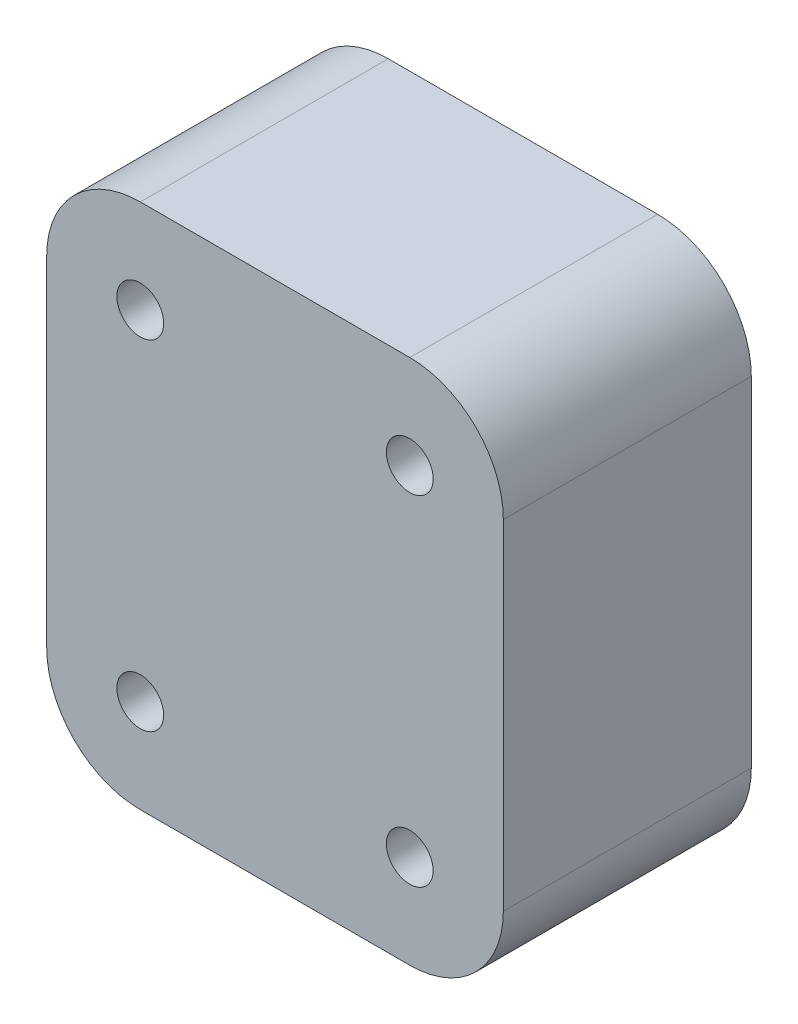
ISO-10303-21;
HEADER;
FILE_DESCRIPTION(('STEP AP214'),'2;1');
FILE_NAME('part.step','',(''),(''),'','','');
FILE_SCHEMA(('AUTOMOTIVE_DESIGN { 1 0 10303 214 1 1 1 1 }'));
ENDSEC;
DATA;
#1=APPLICATION_CONTEXT('core data for automotive mechanical design processes');
#2=APPLICATION_PROTOCOL_DEFINITION('international standard','automotive_design',2000,#1);
#3=PRODUCT_CONTEXT('',#1,'mechanical');
#4=PRODUCT('Part','Part','',(#3));
#5=PRODUCT_RELATED_PRODUCT_CATEGORY('part','',(#4));
#6=PRODUCT_DEFINITION_FORMATION('','',#4);
#7=PRODUCT_DEFINITION_CONTEXT('part definition',#1,'design');
#8=PRODUCT_DEFINITION('design','',#6,#7);
#9=PRODUCT_DEFINITION_SHAPE('','',#8);
#10=(LENGTH_UNIT() NAMED_UNIT(*) SI_UNIT(.MILLI.,.METRE.));
#11=(NAMED_UNIT(*) PLANE_ANGLE_UNIT() SI_UNIT($,.RADIAN.));
#12=(NAMED_UNIT(*) SI_UNIT($,.STERADIAN.) SOLID_ANGLE_UNIT());
#13=UNCERTAINTY_MEASURE_WITH_UNIT(LENGTH_MEASURE(1.E-05),#10,'distance_accuracy_value','');
#14=(GEOMETRIC_REPRESENTATION_CONTEXT(3) GLOBAL_UNCERTAINTY_ASSIGNED_CONTEXT((#13)) GLOBAL_UNIT_ASSIGNED_CONTEXT((#10,
#11,#12)) REPRESENTATION_CONTEXT('',''));
#15=CARTESIAN_POINT('',(0.,0.,0.));
#16=DIRECTION('',(0.,0.,1.));
#17=DIRECTION('',(1.,0.,0.));
#18=AXIS2_PLACEMENT_3D('',#15,#16,#17);
#19=CARTESIAN_POINT('',(0.,0.,26.5));
#20=DIRECTION('',(0.,0.,-1.));
#21=DIRECTION('',(-1.,0.,0.));
#22=AXIS2_PLACEMENT_3D('',#19,#20,#21);
#23=PLANE('',#22);
#24=DIRECTION('',(0.,-1.,0.));
#25=VECTOR('',#24,1.);
#26=CARTESIAN_POINT('',(-40.1937500000003,28.125,26.5));
#27=LINE('',#26,#25);
#28=CARTESIAN_POINT('',(-40.1937500000003,18.125,26.5));
#29=VERTEX_POINT('',#28);
#30=CARTESIAN_POINT('',(-40.1937500000003,-18.125,26.5));
#31=VERTEX_POINT('',#30);
#32=EDGE_CURVE('E168',#29,#31,#27,.T.);
#33=ORIENTED_EDGE('',*,*,#32,.T.);
#34=CARTESIAN_POINT('',(-30.1937500000003,-18.125,26.5));
#35=DIRECTION('',(0.,0.,-1.));
#36=DIRECTION('',(-1.,0.,0.));
#37=AXIS2_PLACEMENT_3D('',#34,#35,#36);
#38=CIRCLE('',#37,10.);
#39=CARTESIAN_POINT('',(-30.1937500000003,-28.125,26.5));
#40=VERTEX_POINT('',#39);
#41=EDGE_CURVE('E148',#31,#40,#38,.F.);
#42=ORIENTED_EDGE('',*,*,#41,.T.);
#43=DIRECTION('',(1.,0.,0.));
#44=VECTOR('',#43,1.);
#45=CARTESIAN_POINT('',(-40.1937500000003,-28.125,26.5));
#46=LINE('',#45,#44);
#47=CARTESIAN_POINT('',(-1.39375000000027,-28.125,26.5));
#48=VERTEX_POINT('',#47);
#49=EDGE_CURVE('E118',#40,#48,#46,.T.);
#50=ORIENTED_EDGE('',*,*,#49,.T.);
#51=CARTESIAN_POINT('',(-1.39375000000027,-18.125,26.5));
#52=DIRECTION('',(0.,0.,-1.));
#53=DIRECTION('',(-1.,0.,0.));
#54=AXIS2_PLACEMENT_3D('',#51,#52,#53);
#55=CIRCLE('',#54,10.);
#56=CARTESIAN_POINT('',(8.60624999999973,-18.125,26.5));
#57=VERTEX_POINT('',#56);
#58=EDGE_CURVE('E54',#48,#57,#55,.F.);
#59=ORIENTED_EDGE('',*,*,#58,.T.);
#60=DIRECTION('',(0.,1.,0.));
#61=VECTOR('',#60,1.);
#62=CARTESIAN_POINT('',(8.60624999999974,28.125,26.5));
#63=LINE('',#62,#61);
#64=CARTESIAN_POINT('',(8.60624999999974,18.125,26.5));
#65=VERTEX_POINT('',#64);
#66=EDGE_CURVE('E135',#57,#65,#63,.T.);
#67=ORIENTED_EDGE('',*,*,#66,.T.);
#68=CARTESIAN_POINT('',(-1.39375000000026,18.125,26.5));
#69=DIRECTION('',(0.,0.,-1.));
#70=DIRECTION('',(-1.,0.,0.));
#71=AXIS2_PLACEMENT_3D('',#68,#69,#70);
#72=CIRCLE('',#71,10.);
#73=CARTESIAN_POINT('',(-1.39375000000026,28.125,26.5));
#74=VERTEX_POINT('',#73);
#75=EDGE_CURVE('E143',#65,#74,#72,.F.);
#76=ORIENTED_EDGE('',*,*,#75,.T.);
#77=DIRECTION('',(-1.,0.,0.));
#78=VECTOR('',#77,1.);
#79=CARTESIAN_POINT('',(-40.1937500000003,28.125,26.5));
#80=LINE('',#79,#78);
#81=CARTESIAN_POINT('',(-30.1937500000003,28.125,26.5));
#82=VERTEX_POINT('',#81);
#83=EDGE_CURVE('E129',#74,#82,#80,.T.);
#84=ORIENTED_EDGE('',*,*,#83,.T.);
#85=CARTESIAN_POINT('',(-30.1937500000003,18.125,26.5));
#86=DIRECTION('',(0.,0.,-1.));
#87=DIRECTION('',(-1.,0.,0.));
#88=AXIS2_PLACEMENT_3D('',#85,#86,#87);
#89=CIRCLE('',#88,10.);
#90=EDGE_CURVE('E146',#82,#29,#89,.F.);
#91=ORIENTED_EDGE('',*,*,#90,.T.);
#92=EDGE_LOOP('',(#33,#42,#50,#59,#67,#76,#84,#91));
#93=FACE_BOUND('',#92,.T.);
#94=CARTESIAN_POINT('',(-1.39375000000027,-18.125,26.5));
#95=DIRECTION('',(0.,0.,1.));
#96=DIRECTION('',(1.,0.,0.));
#97=AXIS2_PLACEMENT_3D('',#94,#95,#96);
#98=CIRCLE('',#97,2.5);
#99=CARTESIAN_POINT('',(1.10624999999973,-18.125,26.5));
#100=VERTEX_POINT('',#99);
#101=EDGE_CURVE('E174',#100,#100,#98,.T.);
#102=ORIENTED_EDGE('',*,*,#101,.F.);
#103=EDGE_LOOP('',(#102));
#104=FACE_BOUND('',#103,.T.);
#105=CARTESIAN_POINT('',(-30.1937500000003,-18.125,26.5));
#106=DIRECTION('',(0.,0.,1.));
#107=DIRECTION('',(1.,0.,0.));
#108=AXIS2_PLACEMENT_3D('',#105,#106,#107);
#109=CIRCLE('',#108,2.5);
#110=CARTESIAN_POINT('',(-27.6937500000003,-18.125,26.5));
#111=VERTEX_POINT('',#110);
#112=EDGE_CURVE('E183',#111,#111,#109,.T.);
#113=ORIENTED_EDGE('',*,*,#112,.F.);
#114=EDGE_LOOP('',(#113));
#115=FACE_BOUND('',#114,.T.);
#116=CARTESIAN_POINT('',(-1.39375000000027,18.125,26.5));
#117=DIRECTION('',(0.,0.,1.));
#118=DIRECTION('',(1.,0.,0.));
#119=AXIS2_PLACEMENT_3D('',#116,#117,#118);
#120=CIRCLE('',#119,2.5);
#121=CARTESIAN_POINT('',(1.10624999999973,18.125,26.5));
#122=VERTEX_POINT('',#121);
#123=EDGE_CURVE('E188',#122,#122,#120,.T.);
#124=ORIENTED_EDGE('',*,*,#123,.F.);
#125=EDGE_LOOP('',(#124));
#126=FACE_BOUND('',#125,.T.);
#127=CARTESIAN_POINT('',(-30.1937500000003,18.125,26.5));
#128=DIRECTION('',(0.,0.,1.));
#129=DIRECTION('',(1.,0.,0.));
#130=AXIS2_PLACEMENT_3D('',#127,#128,#129);
#131=CIRCLE('',#130,2.5);
#132=CARTESIAN_POINT('',(-27.6937500000003,18.125,26.5));
#133=VERTEX_POINT('',#132);
#134=EDGE_CURVE('E194',#133,#133,#131,.T.);
#135=ORIENTED_EDGE('',*,*,#134,.F.);
#136=EDGE_LOOP('',(#135));
#137=FACE_BOUND('',#136,.T.);
#138=ADVANCED_FACE('F33',(#93,#104,#115,#126,#137),#23,.F.);
#139=CARTESIAN_POINT('',(0.,0.,0.));
#140=DIRECTION('',(0.,0.,-1.));
#141=DIRECTION('',(-1.,0.,0.));
#142=AXIS2_PLACEMENT_3D('',#139,#140,#141);
#143=PLANE('',#142);
#144=CARTESIAN_POINT('',(-1.39375000000027,18.125,0.));
#145=DIRECTION('',(0.,0.,1.));
#146=DIRECTION('',(1.,0.,0.));
#147=AXIS2_PLACEMENT_3D('',#144,#145,#146);
#148=CIRCLE('',#147,2.5);
#149=CARTESIAN_POINT('',(1.10624999999973,18.125,0.));
#150=VERTEX_POINT('',#149);
#151=EDGE_CURVE('E191',#150,#150,#148,.T.);
#152=ORIENTED_EDGE('',*,*,#151,.T.);
#153=EDGE_LOOP('',(#152));
#154=FACE_BOUND('',#153,.T.);
#155=CARTESIAN_POINT('',(-1.39375000000027,-18.125,0.));
#156=DIRECTION('',(0.,0.,1.));
#157=DIRECTION('',(1.,0.,0.));
#158=AXIS2_PLACEMENT_3D('',#155,#156,#157);
#159=CIRCLE('',#158,2.5);
#160=CARTESIAN_POINT('',(1.10624999999973,-18.125,0.));
#161=VERTEX_POINT('',#160);
#162=EDGE_CURVE('E176',#161,#161,#159,.T.);
#163=ORIENTED_EDGE('',*,*,#162,.T.);
#164=EDGE_LOOP('',(#163));
#165=FACE_BOUND('',#164,.T.);
#166=DIRECTION('',(1.,0.,0.));
#167=VECTOR('',#166,1.);
#168=CARTESIAN_POINT('',(-40.1937500000003,-28.125,0.));
#169=LINE('',#168,#167);
#170=CARTESIAN_POINT('',(-30.1937500000003,-28.125,0.));
#171=VERTEX_POINT('',#170);
#172=CARTESIAN_POINT('',(-1.39375000000027,-28.125,0.));
#173=VERTEX_POINT('',#172);
#174=EDGE_CURVE('E116',#171,#173,#169,.T.);
#175=ORIENTED_EDGE('',*,*,#174,.F.);
#176=CARTESIAN_POINT('',(-30.1937500000003,-18.125,0.));
#177=DIRECTION('',(0.,0.,-1.));
#178=DIRECTION('',(-1.,0.,0.));
#179=AXIS2_PLACEMENT_3D('',#176,#177,#178);
#180=CIRCLE('',#179,10.);
#181=CARTESIAN_POINT('',(-40.1937500000003,-18.125,0.));
#182=VERTEX_POINT('',#181);
#183=EDGE_CURVE('E99',#171,#182,#180,.T.);
#184=ORIENTED_EDGE('',*,*,#183,.T.);
#185=DIRECTION('',(0.,-1.,0.));
#186=VECTOR('',#185,1.);
#187=CARTESIAN_POINT('',(-40.1937500000003,28.125,0.));
#188=LINE('',#187,#186);
#189=CARTESIAN_POINT('',(-40.1937500000003,18.125,0.));
#190=VERTEX_POINT('',#189);
#191=EDGE_CURVE('E127',#190,#182,#188,.T.);
#192=ORIENTED_EDGE('',*,*,#191,.F.);
#193=CARTESIAN_POINT('',(-30.1937500000003,18.125,0.));
#194=DIRECTION('',(0.,0.,-1.));
#195=DIRECTION('',(-1.,0.,0.));
#196=AXIS2_PLACEMENT_3D('',#193,#194,#195);
#197=CIRCLE('',#196,10.);
#198=CARTESIAN_POINT('',(-30.1937500000003,28.125,0.));
#199=VERTEX_POINT('',#198);
#200=EDGE_CURVE('E110',#190,#199,#197,.T.);
#201=ORIENTED_EDGE('',*,*,#200,.T.);
#202=DIRECTION('',(-1.,0.,0.));
#203=VECTOR('',#202,1.);
#204=CARTESIAN_POINT('',(-40.1937500000003,28.125,0.));
#205=LINE('',#204,#203);
#206=CARTESIAN_POINT('',(-1.39375000000026,28.125,0.));
#207=VERTEX_POINT('',#206);
#208=EDGE_CURVE('E131',#207,#199,#205,.T.);
#209=ORIENTED_EDGE('',*,*,#208,.F.);
#210=CARTESIAN_POINT('',(-1.39375000000026,18.125,0.));
#211=DIRECTION('',(0.,0.,-1.));
#212=DIRECTION('',(-1.,0.,0.));
#213=AXIS2_PLACEMENT_3D('',#210,#211,#212);
#214=CIRCLE('',#213,10.);
#215=CARTESIAN_POINT('',(8.60624999999974,18.125,0.));
#216=VERTEX_POINT('',#215);
#217=EDGE_CURVE('E119',#207,#216,#214,.T.);
#218=ORIENTED_EDGE('',*,*,#217,.T.);
#219=DIRECTION('',(0.,1.,0.));
#220=VECTOR('',#219,1.);
#221=CARTESIAN_POINT('',(8.60624999999974,28.125,0.));
#222=LINE('',#221,#220);
#223=CARTESIAN_POINT('',(8.60624999999973,-18.125,0.));
#224=VERTEX_POINT('',#223);
#225=EDGE_CURVE('E126',#224,#216,#222,.T.);
#226=ORIENTED_EDGE('',*,*,#225,.F.);
#227=CARTESIAN_POINT('',(-1.39375000000027,-18.125,0.));
#228=DIRECTION('',(0.,0.,-1.));
#229=DIRECTION('',(-1.,0.,0.));
#230=AXIS2_PLACEMENT_3D('',#227,#228,#229);
#231=CIRCLE('',#230,10.);
#232=EDGE_CURVE('E125',#224,#173,#231,.T.);
#233=ORIENTED_EDGE('',*,*,#232,.T.);
#234=EDGE_LOOP('',(#175,#184,#192,#201,#209,#218,#226,#233));
#235=FACE_BOUND('',#234,.T.);
#236=CARTESIAN_POINT('',(-30.1937500000003,-18.125,0.));
#237=DIRECTION('',(0.,0.,1.));
#238=DIRECTION('',(1.,0.,0.));
#239=AXIS2_PLACEMENT_3D('',#236,#237,#238);
#240=CIRCLE('',#239,2.5);
#241=CARTESIAN_POINT('',(-27.6937500000003,-18.125,0.));
#242=VERTEX_POINT('',#241);
#243=EDGE_CURVE('E185',#242,#242,#240,.T.);
#244=ORIENTED_EDGE('',*,*,#243,.T.);
#245=EDGE_LOOP('',(#244));
#246=FACE_BOUND('',#245,.T.);
#247=CARTESIAN_POINT('',(-30.1937500000003,18.125,0.));
#248=DIRECTION('',(0.,0.,1.));
#249=DIRECTION('',(1.,0.,0.));
#250=AXIS2_PLACEMENT_3D('',#247,#248,#249);
#251=CIRCLE('',#250,2.5);
#252=CARTESIAN_POINT('',(-27.6937500000003,18.125,0.));
#253=VERTEX_POINT('',#252);
#254=EDGE_CURVE('E197',#253,#253,#251,.T.);
#255=ORIENTED_EDGE('',*,*,#254,.T.);
#256=EDGE_LOOP('',(#255));
#257=FACE_BOUND('',#256,.T.);
#258=ADVANCED_FACE('F122',(#154,#165,#235,#246,#257),#143,.T.);
#259=CARTESIAN_POINT('',(-40.1937500000003,28.125,26.5));
#260=DIRECTION('',(0.,-1.,0.));
#261=DIRECTION('',(0.,0.,-1.));
#262=AXIS2_PLACEMENT_3D('',#259,#260,#261);
#263=PLANE('',#262);
#264=ORIENTED_EDGE('',*,*,#208,.T.);
#265=DIRECTION('',(0.,0.,-1.));
#266=VECTOR('',#265,1.);
#267=CARTESIAN_POINT('',(-30.1937500000003,28.125,26.5));
#268=LINE('',#267,#266);
#269=EDGE_CURVE('E153',#199,#82,#268,.F.);
#270=ORIENTED_EDGE('',*,*,#269,.T.);
#271=ORIENTED_EDGE('',*,*,#83,.F.);
#272=DIRECTION('',(0.,0.,-1.));
#273=VECTOR('',#272,1.);
#274=CARTESIAN_POINT('',(-1.39375000000026,28.125,26.5));
#275=LINE('',#274,#273);
#276=EDGE_CURVE('E150',#74,#207,#275,.T.);
#277=ORIENTED_EDGE('',*,*,#276,.T.);
#278=EDGE_LOOP('',(#264,#270,#271,#277));
#279=FACE_BOUND('',#278,.T.);
#280=ADVANCED_FACE('F159',(#279),#263,.F.);
#281=CARTESIAN_POINT('',(-40.1937500000003,28.125,26.5));
#282=DIRECTION('',(1.,0.,0.));
#283=DIRECTION('',(0.,0.,-1.));
#284=AXIS2_PLACEMENT_3D('',#281,#282,#283);
#285=PLANE('',#284);
#286=ORIENTED_EDGE('',*,*,#191,.T.);
#287=DIRECTION('',(0.,0.,-1.));
#288=VECTOR('',#287,1.);
#289=CARTESIAN_POINT('',(-40.1937500000003,-18.125,26.5));
#290=LINE('',#289,#288);
#291=EDGE_CURVE('E104',#182,#31,#290,.F.);
#292=ORIENTED_EDGE('',*,*,#291,.T.);
#293=ORIENTED_EDGE('',*,*,#32,.F.);
#294=DIRECTION('',(0.,0.,-1.));
#295=VECTOR('',#294,1.);
#296=CARTESIAN_POINT('',(-40.1937500000003,18.125,26.5));
#297=LINE('',#296,#295);
#298=EDGE_CURVE('E109',#29,#190,#297,.T.);
#299=ORIENTED_EDGE('',*,*,#298,.T.);
#300=EDGE_LOOP('',(#286,#292,#293,#299));
#301=FACE_BOUND('',#300,.T.);
#302=ADVANCED_FACE('F173',(#301),#285,.F.);
#303=CARTESIAN_POINT('',(-40.1937500000003,-28.125,26.5));
#304=DIRECTION('',(0.,1.,0.));
#305=DIRECTION('',(0.,0.,1.));
#306=AXIS2_PLACEMENT_3D('',#303,#304,#305);
#307=PLANE('',#306);
#308=ORIENTED_EDGE('',*,*,#49,.F.);
#309=DIRECTION('',(0.,0.,-1.));
#310=VECTOR('',#309,1.);
#311=CARTESIAN_POINT('',(-30.1937500000003,-28.125,26.5));
#312=LINE('',#311,#310);
#313=EDGE_CURVE('E103',#40,#171,#312,.T.);
#314=ORIENTED_EDGE('',*,*,#313,.T.);
#315=ORIENTED_EDGE('',*,*,#174,.T.);
#316=DIRECTION('',(0.,0.,-1.));
#317=VECTOR('',#316,1.);
#318=CARTESIAN_POINT('',(-1.39375000000027,-28.125,26.5));
#319=LINE('',#318,#317);
#320=EDGE_CURVE('E120',#173,#48,#319,.F.);
#321=ORIENTED_EDGE('',*,*,#320,.T.);
#322=EDGE_LOOP('',(#308,#314,#315,#321));
#323=FACE_BOUND('',#322,.T.);
#324=ADVANCED_FACE('F115',(#323),#307,.F.);
#325=CARTESIAN_POINT('',(8.60624999999974,28.125,26.5));
#326=DIRECTION('',(-1.,0.,0.));
#327=DIRECTION('',(0.,-1.,0.));
#328=AXIS2_PLACEMENT_3D('',#325,#326,#327);
#329=PLANE('',#328);
#330=ORIENTED_EDGE('',*,*,#66,.F.);
#331=DIRECTION('',(0.,0.,-1.));
#332=VECTOR('',#331,1.);
#333=CARTESIAN_POINT('',(8.60624999999973,-18.125,26.5));
#334=LINE('',#333,#332);
#335=EDGE_CURVE('E11',#57,#224,#334,.T.);
#336=ORIENTED_EDGE('',*,*,#335,.T.);
#337=ORIENTED_EDGE('',*,*,#225,.T.);
#338=DIRECTION('',(0.,0.,-1.));
#339=VECTOR('',#338,1.);
#340=CARTESIAN_POINT('',(8.60624999999974,18.125,26.5));
#341=LINE('',#340,#339);
#342=EDGE_CURVE('E41',#216,#65,#341,.F.);
#343=ORIENTED_EDGE('',*,*,#342,.T.);
#344=EDGE_LOOP('',(#330,#336,#337,#343));
#345=FACE_BOUND('',#344,.T.);
#346=ADVANCED_FACE('F217',(#345),#329,.F.);
#347=CARTESIAN_POINT('',(-1.39375000000027,-18.125,26.5));
#348=DIRECTION('',(0.,0.,-1.));
#349=DIRECTION('',(-1.,0.,0.));
#350=AXIS2_PLACEMENT_3D('',#347,#348,#349);
#351=CYLINDRICAL_SURFACE('',#350,2.5);
#352=ORIENTED_EDGE('',*,*,#101,.T.);
#353=EDGE_LOOP('',(#352));
#354=FACE_BOUND('',#353,.T.);
#355=ORIENTED_EDGE('',*,*,#162,.F.);
#356=EDGE_LOOP('',(#355));
#357=FACE_BOUND('',#356,.T.);
#358=ADVANCED_FACE('F214',(#354,#357),#351,.F.);
#359=CARTESIAN_POINT('',(-30.1937500000003,-18.125,26.5));
#360=DIRECTION('',(0.,0.,-1.));
#361=DIRECTION('',(-1.,0.,0.));
#362=AXIS2_PLACEMENT_3D('',#359,#360,#361);
#363=CYLINDRICAL_SURFACE('',#362,2.5);
#364=ORIENTED_EDGE('',*,*,#112,.T.);
#365=EDGE_LOOP('',(#364));
#366=FACE_BOUND('',#365,.T.);
#367=ORIENTED_EDGE('',*,*,#243,.F.);
#368=EDGE_LOOP('',(#367));
#369=FACE_BOUND('',#368,.T.);
#370=ADVANCED_FACE('F309',(#366,#369),#363,.F.);
#371=CARTESIAN_POINT('',(-1.39375000000027,18.125,26.5));
#372=DIRECTION('',(0.,0.,-1.));
#373=DIRECTION('',(-1.,0.,0.));
#374=AXIS2_PLACEMENT_3D('',#371,#372,#373);
#375=CYLINDRICAL_SURFACE('',#374,2.5);
#376=ORIENTED_EDGE('',*,*,#123,.T.);
#377=EDGE_LOOP('',(#376));
#378=FACE_BOUND('',#377,.T.);
#379=ORIENTED_EDGE('',*,*,#151,.F.);
#380=EDGE_LOOP('',(#379));
#381=FACE_BOUND('',#380,.T.);
#382=ADVANCED_FACE('F300',(#378,#381),#375,.F.);
#383=CARTESIAN_POINT('',(-30.1937500000003,18.125,26.5));
#384=DIRECTION('',(0.,0.,-1.));
#385=DIRECTION('',(-1.,0.,0.));
#386=AXIS2_PLACEMENT_3D('',#383,#384,#385);
#387=CYLINDRICAL_SURFACE('',#386,2.5);
#388=ORIENTED_EDGE('',*,*,#134,.T.);
#389=EDGE_LOOP('',(#388));
#390=FACE_BOUND('',#389,.T.);
#391=ORIENTED_EDGE('',*,*,#254,.F.);
#392=EDGE_LOOP('',(#391));
#393=FACE_BOUND('',#392,.T.);
#394=ADVANCED_FACE('F203',(#390,#393),#387,.F.);
#395=CARTESIAN_POINT('',(-30.1937500000003,-18.125,26.5));
#396=DIRECTION('',(0.,0.,-1.));
#397=DIRECTION('',(-1.,0.,0.));
#398=AXIS2_PLACEMENT_3D('',#395,#396,#397);
#399=CYLINDRICAL_SURFACE('',#398,10.);
#400=ORIENTED_EDGE('',*,*,#41,.F.);
#401=ORIENTED_EDGE('',*,*,#291,.F.);
#402=ORIENTED_EDGE('',*,*,#183,.F.);
#403=ORIENTED_EDGE('',*,*,#313,.F.);
#404=EDGE_LOOP('',(#400,#401,#402,#403));
#405=FACE_BOUND('',#404,.T.);
#406=ADVANCED_FACE('F102',(#405),#399,.T.);
#407=CARTESIAN_POINT('',(-30.1937500000003,18.125,26.5));
#408=DIRECTION('',(0.,0.,-1.));
#409=DIRECTION('',(-1.,0.,0.));
#410=AXIS2_PLACEMENT_3D('',#407,#408,#409);
#411=CYLINDRICAL_SURFACE('',#410,10.);
#412=ORIENTED_EDGE('',*,*,#90,.F.);
#413=ORIENTED_EDGE('',*,*,#269,.F.);
#414=ORIENTED_EDGE('',*,*,#200,.F.);
#415=ORIENTED_EDGE('',*,*,#298,.F.);
#416=EDGE_LOOP('',(#412,#413,#414,#415));
#417=FACE_BOUND('',#416,.T.);
#418=ADVANCED_FACE('F171',(#417),#411,.T.);
#419=CARTESIAN_POINT('',(-1.39375000000027,-18.125,26.5));
#420=DIRECTION('',(0.,0.,-1.));
#421=DIRECTION('',(-1.,0.,0.));
#422=AXIS2_PLACEMENT_3D('',#419,#420,#421);
#423=CYLINDRICAL_SURFACE('',#422,10.);
#424=ORIENTED_EDGE('',*,*,#58,.F.);
#425=ORIENTED_EDGE('',*,*,#320,.F.);
#426=ORIENTED_EDGE('',*,*,#232,.F.);
#427=ORIENTED_EDGE('',*,*,#335,.F.);
#428=EDGE_LOOP('',(#424,#425,#426,#427));
#429=FACE_BOUND('',#428,.T.);
#430=ADVANCED_FACE('F229',(#429),#423,.T.);
#431=CARTESIAN_POINT('',(-1.39375000000026,18.125,26.5));
#432=DIRECTION('',(0.,0.,-1.));
#433=DIRECTION('',(-1.,0.,0.));
#434=AXIS2_PLACEMENT_3D('',#431,#432,#433);
#435=CYLINDRICAL_SURFACE('',#434,10.);
#436=ORIENTED_EDGE('',*,*,#75,.F.);
#437=ORIENTED_EDGE('',*,*,#342,.F.);
#438=ORIENTED_EDGE('',*,*,#217,.F.);
#439=ORIENTED_EDGE('',*,*,#276,.F.);
#440=EDGE_LOOP('',(#436,#437,#438,#439));
#441=FACE_BOUND('',#440,.T.);
#442=ADVANCED_FACE('F35',(#441),#435,.T.);
#443=CLOSED_SHELL('',(#138,#258,#280,#302,#324,#346,#358,#370,#382,#394,#406,#418,#430,#442));
#444=MANIFOLD_SOLID_BREP('B2',#443);
#445=ADVANCED_BREP_SHAPE_REPRESENTATION('',(#18,#444),#14);
#446=SHAPE_DEFINITION_REPRESENTATION(#9,#445);
ENDSEC;
END-ISO-10303-21;
